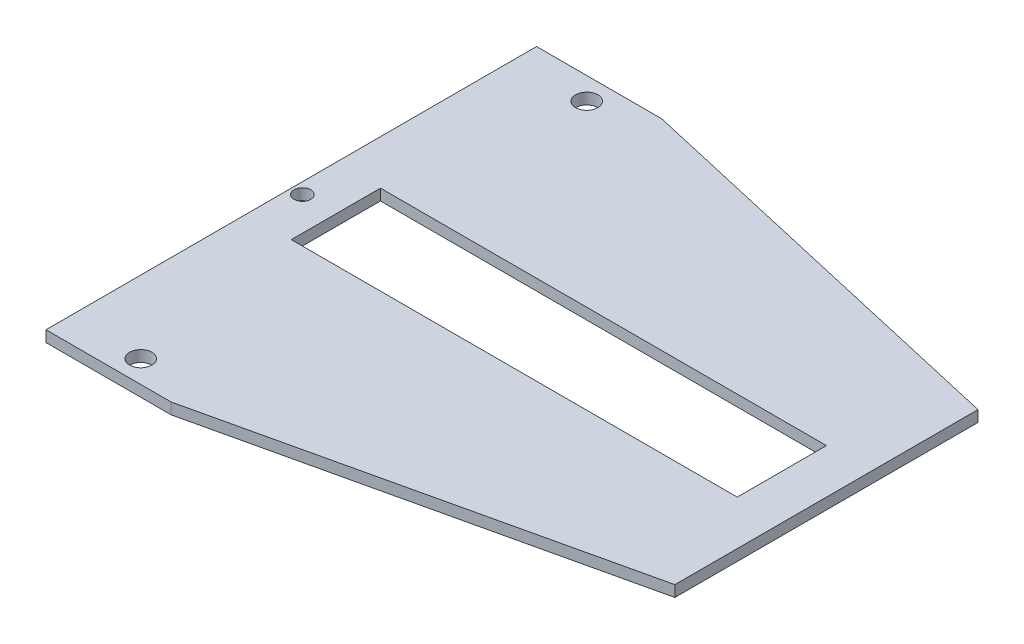
ISO-10303-21;
HEADER;
FILE_DESCRIPTION(('STEP AP214'),'2;1');
FILE_NAME('part.step','',(''),(''),'','','');
FILE_SCHEMA(('AUTOMOTIVE_DESIGN { 1 0 10303 214 1 1 1 1 }'));
ENDSEC;
DATA;
#1=APPLICATION_CONTEXT('core data for automotive mechanical design processes');
#2=APPLICATION_PROTOCOL_DEFINITION('international standard','automotive_design',2000,#1);
#3=PRODUCT_CONTEXT('',#1,'mechanical');
#4=PRODUCT('Part','Part','',(#3));
#5=PRODUCT_RELATED_PRODUCT_CATEGORY('part','',(#4));
#6=PRODUCT_DEFINITION_FORMATION('','',#4);
#7=PRODUCT_DEFINITION_CONTEXT('part definition',#1,'design');
#8=PRODUCT_DEFINITION('design','',#6,#7);
#9=PRODUCT_DEFINITION_SHAPE('','',#8);
#10=(LENGTH_UNIT() NAMED_UNIT(*) SI_UNIT(.MILLI.,.METRE.));
#11=(NAMED_UNIT(*) PLANE_ANGLE_UNIT() SI_UNIT($,.RADIAN.));
#12=(NAMED_UNIT(*) SI_UNIT($,.STERADIAN.) SOLID_ANGLE_UNIT());
#13=UNCERTAINTY_MEASURE_WITH_UNIT(LENGTH_MEASURE(1.E-05),#10,'distance_accuracy_value','');
#14=(GEOMETRIC_REPRESENTATION_CONTEXT(3) GLOBAL_UNCERTAINTY_ASSIGNED_CONTEXT((#13)) GLOBAL_UNIT_ASSIGNED_CONTEXT((#10,
#11,#12)) REPRESENTATION_CONTEXT('',''));
#15=CARTESIAN_POINT('',(0.,0.,0.));
#16=DIRECTION('',(0.,0.,1.));
#17=DIRECTION('',(1.,0.,0.));
#18=AXIS2_PLACEMENT_3D('',#15,#16,#17);
#19=CARTESIAN_POINT('',(0.,6.35,0.));
#20=DIRECTION('',(0.,-1.,0.));
#21=DIRECTION('',(0.,0.,-1.));
#22=AXIS2_PLACEMENT_3D('',#19,#20,#21);
#23=PLANE('',#22);
#24=CARTESIAN_POINT('',(41.27321438,6.35,127.));
#25=DIRECTION('',(0.,1.,0.));
#26=DIRECTION('',(0.,0.,1.));
#27=AXIS2_PLACEMENT_3D('',#24,#25,#26);
#28=CIRCLE('',#27,6.35);
#29=CARTESIAN_POINT('',(41.27321438,6.35,133.35));
#30=VERTEX_POINT('',#29);
#31=EDGE_CURVE('E151',#30,#30,#28,.T.);
#32=ORIENTED_EDGE('',*,*,#31,.F.);
#33=EDGE_LOOP('',(#32));
#34=FACE_BOUND('',#33,.T.);
#35=DIRECTION('',(0.974858506578448,0.,-0.222824801473349));
#36=VECTOR('',#35,1.);
#37=CARTESIAN_POINT('',(71.282950652,6.35,139.7));
#38=LINE('',#37,#36);
#39=CARTESIAN_POINT('',(71.282950652,6.35,139.7));
#40=VERTEX_POINT('',#39);
#41=CARTESIAN_POINT('',(304.8,6.35,86.324674442));
#42=VERTEX_POINT('',#41);
#43=EDGE_CURVE('E157',#40,#42,#38,.T.);
#44=ORIENTED_EDGE('',*,*,#43,.T.);
#45=DIRECTION('',(0.,0.,-1.));
#46=VECTOR('',#45,1.);
#47=CARTESIAN_POINT('',(304.8,6.35,-86.324674442));
#48=LINE('',#47,#46);
#49=CARTESIAN_POINT('',(304.8,6.35,-86.324674442));
#50=VERTEX_POINT('',#49);
#51=EDGE_CURVE('E160',#42,#50,#48,.T.);
#52=ORIENTED_EDGE('',*,*,#51,.T.);
#53=DIRECTION('',(-0.974858506578448,0.,-0.222824801473349));
#54=VECTOR('',#53,1.);
#55=CARTESIAN_POINT('',(71.2829506519999,6.35,-139.7));
#56=LINE('',#55,#54);
#57=CARTESIAN_POINT('',(71.2829506519999,6.35,-139.7));
#58=VERTEX_POINT('',#57);
#59=EDGE_CURVE('E163',#50,#58,#56,.T.);
#60=ORIENTED_EDGE('',*,*,#59,.T.);
#61=DIRECTION('',(-1.,0.,0.));
#62=VECTOR('',#61,1.);
#63=CARTESIAN_POINT('',(0.,6.35,-139.7));
#64=LINE('',#63,#62);
#65=CARTESIAN_POINT('',(0.,6.35,-139.7));
#66=VERTEX_POINT('',#65);
#67=EDGE_CURVE('E165',#58,#66,#64,.T.);
#68=ORIENTED_EDGE('',*,*,#67,.T.);
#69=DIRECTION('',(0.,0.,1.));
#70=VECTOR('',#69,1.);
#71=CARTESIAN_POINT('',(0.,6.35,-86.324674442));
#72=LINE('',#71,#70);
#73=CARTESIAN_POINT('',(0.,6.35,139.7));
#74=VERTEX_POINT('',#73);
#75=EDGE_CURVE('E167',#66,#74,#72,.T.);
#76=ORIENTED_EDGE('',*,*,#75,.T.);
#77=DIRECTION('',(1.,0.,0.));
#78=VECTOR('',#77,1.);
#79=CARTESIAN_POINT('',(0.,6.35,139.7));
#80=LINE('',#79,#78);
#81=EDGE_CURVE('E169',#74,#40,#80,.T.);
#82=ORIENTED_EDGE('',*,*,#81,.T.);
#83=EDGE_LOOP('',(#44,#52,#60,#68,#76,#82));
#84=FACE_BOUND('',#83,.T.);
#85=DIRECTION('',(0.,0.,1.));
#86=VECTOR('',#85,1.);
#87=CARTESIAN_POINT('',(25.4,6.35,-6.35));
#88=LINE('',#87,#86);
#89=CARTESIAN_POINT('',(25.4,6.35,-25.400000000001));
#90=VERTEX_POINT('',#89);
#91=CARTESIAN_POINT('',(25.4,6.35,25.400000000001));
#92=VERTEX_POINT('',#91);
#93=EDGE_CURVE('E110',#90,#92,#88,.T.);
#94=ORIENTED_EDGE('',*,*,#93,.F.);
#95=DIRECTION('',(-1.,0.,0.));
#96=VECTOR('',#95,1.);
#97=CARTESIAN_POINT('',(279.4,6.35,-25.4));
#98=LINE('',#97,#96);
#99=CARTESIAN_POINT('',(279.4,6.35,-25.4));
#100=VERTEX_POINT('',#99);
#101=EDGE_CURVE('E134',#100,#90,#98,.T.);
#102=ORIENTED_EDGE('',*,*,#101,.F.);
#103=DIRECTION('',(0.,0.,-1.));
#104=VECTOR('',#103,1.);
#105=CARTESIAN_POINT('',(279.4,6.35,-25.4));
#106=LINE('',#105,#104);
#107=CARTESIAN_POINT('',(279.4,6.35,25.4));
#108=VERTEX_POINT('',#107);
#109=EDGE_CURVE('E132',#108,#100,#106,.T.);
#110=ORIENTED_EDGE('',*,*,#109,.F.);
#111=DIRECTION('',(1.,0.,0.));
#112=VECTOR('',#111,1.);
#113=CARTESIAN_POINT('',(279.4,6.35,25.4));
#114=LINE('',#113,#112);
#115=EDGE_CURVE('E118',#92,#108,#114,.T.);
#116=ORIENTED_EDGE('',*,*,#115,.F.);
#117=EDGE_LOOP('',(#94,#102,#110,#116));
#118=FACE_BOUND('',#117,.T.);
#119=CARTESIAN_POINT('',(41.27321438,6.35,-127.));
#120=DIRECTION('',(0.,1.,0.));
#121=DIRECTION('',(0.,0.,-1.));
#122=AXIS2_PLACEMENT_3D('',#119,#120,#121);
#123=CIRCLE('',#122,6.35);
#124=CARTESIAN_POINT('',(41.27321438,6.35,-133.35));
#125=VERTEX_POINT('',#124);
#126=EDGE_CURVE('E141',#125,#125,#123,.T.);
#127=ORIENTED_EDGE('',*,*,#126,.F.);
#128=EDGE_LOOP('',(#127));
#129=FACE_BOUND('',#128,.T.);
#130=CARTESIAN_POINT('',(6.34821437999999,6.35,0.));
#131=DIRECTION('',(0.,1.,0.));
#132=DIRECTION('',(0.,0.,1.));
#133=AXIS2_PLACEMENT_3D('',#130,#131,#132);
#134=CIRCLE('',#133,4.7625);
#135=CARTESIAN_POINT('',(6.34821437999999,6.35,4.7625));
#136=VERTEX_POINT('',#135);
#137=EDGE_CURVE('E268',#136,#136,#134,.T.);
#138=ORIENTED_EDGE('',*,*,#137,.F.);
#139=EDGE_LOOP('',(#138));
#140=FACE_BOUND('',#139,.T.);
#141=ADVANCED_FACE('F35',(#34,#84,#118,#129,#140),#23,.F.);
#142=CARTESIAN_POINT('',(0.,0.,0.));
#143=DIRECTION('',(0.,-1.,0.));
#144=DIRECTION('',(0.,0.,-1.));
#145=AXIS2_PLACEMENT_3D('',#142,#143,#144);
#146=PLANE('',#145);
#147=CARTESIAN_POINT('',(41.27321438,0.,-127.));
#148=DIRECTION('',(0.,1.,0.));
#149=DIRECTION('',(0.,0.,-1.));
#150=AXIS2_PLACEMENT_3D('',#147,#148,#149);
#151=CIRCLE('',#150,6.35);
#152=CARTESIAN_POINT('',(41.27321438,0.,-133.35));
#153=VERTEX_POINT('',#152);
#154=EDGE_CURVE('E274',#153,#153,#151,.T.);
#155=ORIENTED_EDGE('',*,*,#154,.T.);
#156=EDGE_LOOP('',(#155));
#157=FACE_BOUND('',#156,.T.);
#158=DIRECTION('',(0.974858506578448,0.,-0.222824801473349));
#159=VECTOR('',#158,1.);
#160=CARTESIAN_POINT('',(71.282950652,0.,139.7));
#161=LINE('',#160,#159);
#162=CARTESIAN_POINT('',(71.282950652,0.,139.7));
#163=VERTEX_POINT('',#162);
#164=CARTESIAN_POINT('',(304.8,0.,86.324674442));
#165=VERTEX_POINT('',#164);
#166=EDGE_CURVE('E154',#163,#165,#161,.T.);
#167=ORIENTED_EDGE('',*,*,#166,.F.);
#168=DIRECTION('',(1.,0.,0.));
#169=VECTOR('',#168,1.);
#170=CARTESIAN_POINT('',(0.,0.,139.7));
#171=LINE('',#170,#169);
#172=CARTESIAN_POINT('',(0.,0.,139.7));
#173=VERTEX_POINT('',#172);
#174=EDGE_CURVE('E161',#173,#163,#171,.T.);
#175=ORIENTED_EDGE('',*,*,#174,.F.);
#176=DIRECTION('',(0.,0.,1.));
#177=VECTOR('',#176,1.);
#178=CARTESIAN_POINT('',(0.,0.,86.324674442));
#179=LINE('',#178,#177);
#180=CARTESIAN_POINT('',(0.,0.,-139.7));
#181=VERTEX_POINT('',#180);
#182=EDGE_CURVE('E181',#181,#173,#179,.T.);
#183=ORIENTED_EDGE('',*,*,#182,.F.);
#184=DIRECTION('',(-1.,0.,0.));
#185=VECTOR('',#184,1.);
#186=CARTESIAN_POINT('',(0.,0.,-139.7));
#187=LINE('',#186,#185);
#188=CARTESIAN_POINT('',(71.2829506519999,0.,-139.7));
#189=VERTEX_POINT('',#188);
#190=EDGE_CURVE('E178',#189,#181,#187,.T.);
#191=ORIENTED_EDGE('',*,*,#190,.F.);
#192=DIRECTION('',(-0.974858506578448,0.,-0.222824801473349));
#193=VECTOR('',#192,1.);
#194=CARTESIAN_POINT('',(71.2829506519999,0.,-139.7));
#195=LINE('',#194,#193);
#196=CARTESIAN_POINT('',(304.8,0.,-86.324674442));
#197=VERTEX_POINT('',#196);
#198=EDGE_CURVE('E176',#197,#189,#195,.T.);
#199=ORIENTED_EDGE('',*,*,#198,.F.);
#200=DIRECTION('',(0.,0.,-1.));
#201=VECTOR('',#200,1.);
#202=CARTESIAN_POINT('',(304.8,0.,-86.324674442));
#203=LINE('',#202,#201);
#204=EDGE_CURVE('E174',#165,#197,#203,.T.);
#205=ORIENTED_EDGE('',*,*,#204,.F.);
#206=EDGE_LOOP('',(#167,#175,#183,#191,#199,#205));
#207=FACE_BOUND('',#206,.T.);
#208=CARTESIAN_POINT('',(41.27321438,0.,127.));
#209=DIRECTION('',(0.,1.,0.));
#210=DIRECTION('',(0.,0.,1.));
#211=AXIS2_PLACEMENT_3D('',#208,#209,#210);
#212=CIRCLE('',#211,6.35);
#213=CARTESIAN_POINT('',(41.27321438,0.,133.35));
#214=VERTEX_POINT('',#213);
#215=EDGE_CURVE('E127',#214,#214,#212,.T.);
#216=ORIENTED_EDGE('',*,*,#215,.T.);
#217=EDGE_LOOP('',(#216));
#218=FACE_BOUND('',#217,.T.);
#219=DIRECTION('',(-1.,0.,0.));
#220=VECTOR('',#219,1.);
#221=CARTESIAN_POINT('',(279.4,0.,-25.4));
#222=LINE('',#221,#220);
#223=CARTESIAN_POINT('',(279.4,0.,-25.4));
#224=VERTEX_POINT('',#223);
#225=CARTESIAN_POINT('',(25.4,0.,-25.400000000001));
#226=VERTEX_POINT('',#225);
#227=EDGE_CURVE('E119',#224,#226,#222,.T.);
#228=ORIENTED_EDGE('',*,*,#227,.T.);
#229=DIRECTION('',(0.,0.,1.));
#230=VECTOR('',#229,1.);
#231=CARTESIAN_POINT('',(25.4,0.,25.400000000001));
#232=LINE('',#231,#230);
#233=CARTESIAN_POINT('',(25.4,0.,25.400000000001));
#234=VERTEX_POINT('',#233);
#235=EDGE_CURVE('E139',#226,#234,#232,.T.);
#236=ORIENTED_EDGE('',*,*,#235,.T.);
#237=DIRECTION('',(1.,0.,0.));
#238=VECTOR('',#237,1.);
#239=CARTESIAN_POINT('',(279.4,0.,25.4));
#240=LINE('',#239,#238);
#241=CARTESIAN_POINT('',(279.4,0.,25.4));
#242=VERTEX_POINT('',#241);
#243=EDGE_CURVE('E125',#234,#242,#240,.T.);
#244=ORIENTED_EDGE('',*,*,#243,.T.);
#245=DIRECTION('',(0.,0.,-1.));
#246=VECTOR('',#245,1.);
#247=CARTESIAN_POINT('',(279.4,0.,-25.4));
#248=LINE('',#247,#246);
#249=EDGE_CURVE('E143',#242,#224,#248,.T.);
#250=ORIENTED_EDGE('',*,*,#249,.T.);
#251=EDGE_LOOP('',(#228,#236,#244,#250));
#252=FACE_BOUND('',#251,.T.);
#253=CARTESIAN_POINT('',(6.34821437999999,0.,0.));
#254=DIRECTION('',(0.,1.,0.));
#255=DIRECTION('',(0.,0.,1.));
#256=AXIS2_PLACEMENT_3D('',#253,#254,#255);
#257=CIRCLE('',#256,4.7625);
#258=CARTESIAN_POINT('',(6.34821437999999,0.,4.7625));
#259=VERTEX_POINT('',#258);
#260=EDGE_CURVE('E271',#259,#259,#257,.T.);
#261=ORIENTED_EDGE('',*,*,#260,.T.);
#262=EDGE_LOOP('',(#261));
#263=FACE_BOUND('',#262,.T.);
#264=ADVANCED_FACE('F205',(#157,#207,#218,#252,#263),#146,.T.);
#265=CARTESIAN_POINT('',(71.282950652,6.35,139.7));
#266=DIRECTION('',(-0.222824801473349,0.,-0.974858506578448));
#267=DIRECTION('',(-0.974858506578448,0.,0.222824801473349));
#268=AXIS2_PLACEMENT_3D('',#265,#266,#267);
#269=PLANE('',#268);
#270=ORIENTED_EDGE('',*,*,#166,.T.);
#271=DIRECTION('',(0.,-1.,0.));
#272=VECTOR('',#271,1.);
#273=CARTESIAN_POINT('',(304.8,6.35,86.324674442));
#274=LINE('',#273,#272);
#275=EDGE_CURVE('E11',#42,#165,#274,.T.);
#276=ORIENTED_EDGE('',*,*,#275,.F.);
#277=ORIENTED_EDGE('',*,*,#43,.F.);
#278=DIRECTION('',(0.,-1.,0.));
#279=VECTOR('',#278,1.);
#280=CARTESIAN_POINT('',(71.282950652,6.35,139.7));
#281=LINE('',#280,#279);
#282=EDGE_CURVE('E171',#40,#163,#281,.T.);
#283=ORIENTED_EDGE('',*,*,#282,.T.);
#284=EDGE_LOOP('',(#270,#276,#277,#283));
#285=FACE_BOUND('',#284,.T.);
#286=ADVANCED_FACE('F37',(#285),#269,.F.);
#287=CARTESIAN_POINT('',(304.8,6.35,-86.324674442));
#288=DIRECTION('',(-1.,0.,0.));
#289=DIRECTION('',(0.,0.,1.));
#290=AXIS2_PLACEMENT_3D('',#287,#288,#289);
#291=PLANE('',#290);
#292=ORIENTED_EDGE('',*,*,#204,.T.);
#293=DIRECTION('',(0.,-1.,0.));
#294=VECTOR('',#293,1.);
#295=CARTESIAN_POINT('',(304.8,6.35,-86.324674442));
#296=LINE('',#295,#294);
#297=EDGE_CURVE('E43',#50,#197,#296,.T.);
#298=ORIENTED_EDGE('',*,*,#297,.F.);
#299=ORIENTED_EDGE('',*,*,#51,.F.);
#300=ORIENTED_EDGE('',*,*,#275,.T.);
#301=EDGE_LOOP('',(#292,#298,#299,#300));
#302=FACE_BOUND('',#301,.T.);
#303=ADVANCED_FACE('F221',(#302),#291,.F.);
#304=CARTESIAN_POINT('',(71.2829506519999,6.35,-139.7));
#305=DIRECTION('',(-0.222824801473349,0.,0.974858506578448));
#306=DIRECTION('',(0.974858506578448,0.,0.222824801473349));
#307=AXIS2_PLACEMENT_3D('',#304,#305,#306);
#308=PLANE('',#307);
#309=ORIENTED_EDGE('',*,*,#198,.T.);
#310=DIRECTION('',(0.,-1.,0.));
#311=VECTOR('',#310,1.);
#312=CARTESIAN_POINT('',(71.2829506519999,6.35,-139.7));
#313=LINE('',#312,#311);
#314=EDGE_CURVE('E192',#58,#189,#313,.T.);
#315=ORIENTED_EDGE('',*,*,#314,.F.);
#316=ORIENTED_EDGE('',*,*,#59,.F.);
#317=ORIENTED_EDGE('',*,*,#297,.T.);
#318=EDGE_LOOP('',(#309,#315,#316,#317));
#319=FACE_BOUND('',#318,.T.);
#320=ADVANCED_FACE('F199',(#319),#308,.F.);
#321=CARTESIAN_POINT('',(0.,6.35,-139.7));
#322=DIRECTION('',(0.,0.,1.));
#323=DIRECTION('',(1.,0.,0.));
#324=AXIS2_PLACEMENT_3D('',#321,#322,#323);
#325=PLANE('',#324);
#326=ORIENTED_EDGE('',*,*,#190,.T.);
#327=DIRECTION('',(0.,-1.,0.));
#328=VECTOR('',#327,1.);
#329=CARTESIAN_POINT('',(0.,6.35,-139.7));
#330=LINE('',#329,#328);
#331=EDGE_CURVE('E189',#66,#181,#330,.T.);
#332=ORIENTED_EDGE('',*,*,#331,.F.);
#333=ORIENTED_EDGE('',*,*,#67,.F.);
#334=ORIENTED_EDGE('',*,*,#314,.T.);
#335=EDGE_LOOP('',(#326,#332,#333,#334));
#336=FACE_BOUND('',#335,.T.);
#337=ADVANCED_FACE('F210',(#336),#325,.F.);
#338=CARTESIAN_POINT('',(0.,6.35,86.324674442));
#339=DIRECTION('',(1.,0.,0.));
#340=DIRECTION('',(0.,0.,-1.));
#341=AXIS2_PLACEMENT_3D('',#338,#339,#340);
#342=PLANE('',#341);
#343=ORIENTED_EDGE('',*,*,#182,.T.);
#344=DIRECTION('',(0.,-1.,0.));
#345=VECTOR('',#344,1.);
#346=CARTESIAN_POINT('',(0.,6.35,139.7));
#347=LINE('',#346,#345);
#348=EDGE_CURVE('E186',#74,#173,#347,.T.);
#349=ORIENTED_EDGE('',*,*,#348,.F.);
#350=ORIENTED_EDGE('',*,*,#75,.F.);
#351=ORIENTED_EDGE('',*,*,#331,.T.);
#352=EDGE_LOOP('',(#343,#349,#350,#351));
#353=FACE_BOUND('',#352,.T.);
#354=ADVANCED_FACE('F214',(#353),#342,.F.);
#355=CARTESIAN_POINT('',(0.,6.35,139.7));
#356=DIRECTION('',(0.,0.,-1.));
#357=DIRECTION('',(-1.,0.,0.));
#358=AXIS2_PLACEMENT_3D('',#355,#356,#357);
#359=PLANE('',#358);
#360=ORIENTED_EDGE('',*,*,#174,.T.);
#361=ORIENTED_EDGE('',*,*,#282,.F.);
#362=ORIENTED_EDGE('',*,*,#81,.F.);
#363=ORIENTED_EDGE('',*,*,#348,.T.);
#364=EDGE_LOOP('',(#360,#361,#362,#363));
#365=FACE_BOUND('',#364,.T.);
#366=ADVANCED_FACE('F224',(#365),#359,.F.);
#367=CARTESIAN_POINT('',(41.27321438,6.35,127.));
#368=DIRECTION('',(0.,-1.,0.));
#369=DIRECTION('',(0.,0.,-1.));
#370=AXIS2_PLACEMENT_3D('',#367,#368,#369);
#371=CYLINDRICAL_SURFACE('',#370,6.35);
#372=ORIENTED_EDGE('',*,*,#31,.T.);
#373=EDGE_LOOP('',(#372));
#374=FACE_BOUND('',#373,.T.);
#375=ORIENTED_EDGE('',*,*,#215,.F.);
#376=EDGE_LOOP('',(#375));
#377=FACE_BOUND('',#376,.T.);
#378=ADVANCED_FACE('F226',(#374,#377),#371,.F.);
#379=CARTESIAN_POINT('',(25.4,6.35,25.400000000001));
#380=DIRECTION('',(1.,0.,0.));
#381=DIRECTION('',(0.,0.,-1.));
#382=AXIS2_PLACEMENT_3D('',#379,#380,#381);
#383=PLANE('',#382);
#384=ORIENTED_EDGE('',*,*,#235,.F.);
#385=DIRECTION('',(0.,-1.,0.));
#386=VECTOR('',#385,1.);
#387=CARTESIAN_POINT('',(25.4,6.35,-25.400000000001));
#388=LINE('',#387,#386);
#389=EDGE_CURVE('E55',#90,#226,#388,.T.);
#390=ORIENTED_EDGE('',*,*,#389,.F.);
#391=ORIENTED_EDGE('',*,*,#93,.T.);
#392=DIRECTION('',(0.,-1.,0.));
#393=VECTOR('',#392,1.);
#394=CARTESIAN_POINT('',(25.4,6.35,25.400000000001));
#395=LINE('',#394,#393);
#396=EDGE_CURVE('E113',#92,#234,#395,.T.);
#397=ORIENTED_EDGE('',*,*,#396,.T.);
#398=EDGE_LOOP('',(#384,#390,#391,#397));
#399=FACE_BOUND('',#398,.T.);
#400=ADVANCED_FACE('F112',(#399),#383,.T.);
#401=CARTESIAN_POINT('',(279.4,6.35,25.4));
#402=DIRECTION('',(0.,0.,-1.));
#403=DIRECTION('',(-1.,0.,0.));
#404=AXIS2_PLACEMENT_3D('',#401,#402,#403);
#405=PLANE('',#404);
#406=ORIENTED_EDGE('',*,*,#243,.F.);
#407=ORIENTED_EDGE('',*,*,#396,.F.);
#408=ORIENTED_EDGE('',*,*,#115,.T.);
#409=DIRECTION('',(0.,-1.,0.));
#410=VECTOR('',#409,1.);
#411=CARTESIAN_POINT('',(279.4,6.35,25.4));
#412=LINE('',#411,#410);
#413=EDGE_CURVE('E128',#108,#242,#412,.T.);
#414=ORIENTED_EDGE('',*,*,#413,.T.);
#415=EDGE_LOOP('',(#406,#407,#408,#414));
#416=FACE_BOUND('',#415,.T.);
#417=ADVANCED_FACE('F122',(#416),#405,.T.);
#418=CARTESIAN_POINT('',(279.4,6.35,-25.4));
#419=DIRECTION('',(-1.,0.,0.));
#420=DIRECTION('',(0.,0.,1.));
#421=AXIS2_PLACEMENT_3D('',#418,#419,#420);
#422=PLANE('',#421);
#423=ORIENTED_EDGE('',*,*,#249,.F.);
#424=ORIENTED_EDGE('',*,*,#413,.F.);
#425=ORIENTED_EDGE('',*,*,#109,.T.);
#426=DIRECTION('',(0.,-1.,0.));
#427=VECTOR('',#426,1.);
#428=CARTESIAN_POINT('',(279.4,6.35,-25.4));
#429=LINE('',#428,#427);
#430=EDGE_CURVE('E50',#100,#224,#429,.T.);
#431=ORIENTED_EDGE('',*,*,#430,.T.);
#432=EDGE_LOOP('',(#423,#424,#425,#431));
#433=FACE_BOUND('',#432,.T.);
#434=ADVANCED_FACE('F249',(#433),#422,.T.);
#435=CARTESIAN_POINT('',(279.4,6.35,-25.4));
#436=DIRECTION('',(0.,0.,1.));
#437=DIRECTION('',(1.,0.,0.));
#438=AXIS2_PLACEMENT_3D('',#435,#436,#437);
#439=PLANE('',#438);
#440=ORIENTED_EDGE('',*,*,#227,.F.);
#441=ORIENTED_EDGE('',*,*,#430,.F.);
#442=ORIENTED_EDGE('',*,*,#101,.T.);
#443=ORIENTED_EDGE('',*,*,#389,.T.);
#444=EDGE_LOOP('',(#440,#441,#442,#443));
#445=FACE_BOUND('',#444,.T.);
#446=ADVANCED_FACE('F252',(#445),#439,.T.);
#447=CARTESIAN_POINT('',(41.27321438,6.35,-127.));
#448=DIRECTION('',(0.,-1.,0.));
#449=DIRECTION('',(0.,0.,-1.));
#450=AXIS2_PLACEMENT_3D('',#447,#448,#449);
#451=CYLINDRICAL_SURFACE('',#450,6.35);
#452=ORIENTED_EDGE('',*,*,#126,.T.);
#453=EDGE_LOOP('',(#452));
#454=FACE_BOUND('',#453,.T.);
#455=ORIENTED_EDGE('',*,*,#154,.F.);
#456=EDGE_LOOP('',(#455));
#457=FACE_BOUND('',#456,.T.);
#458=ADVANCED_FACE('F256',(#454,#457),#451,.F.);
#459=CARTESIAN_POINT('',(6.34821437999999,6.35,0.));
#460=DIRECTION('',(0.,-1.,0.));
#461=DIRECTION('',(0.,0.,-1.));
#462=AXIS2_PLACEMENT_3D('',#459,#460,#461);
#463=CYLINDRICAL_SURFACE('',#462,4.7625);
#464=ORIENTED_EDGE('',*,*,#137,.T.);
#465=EDGE_LOOP('',(#464));
#466=FACE_BOUND('',#465,.T.);
#467=ORIENTED_EDGE('',*,*,#260,.F.);
#468=EDGE_LOOP('',(#467));
#469=FACE_BOUND('',#468,.T.);
#470=ADVANCED_FACE('F259',(#466,#469),#463,.F.);
#471=CLOSED_SHELL('',(#141,#264,#286,#303,#320,#337,#354,#366,#378,#400,#417,#434,#446,#458,#470));
#472=MANIFOLD_SOLID_BREP('B2',#471);
#473=ADVANCED_BREP_SHAPE_REPRESENTATION('',(#18,#472),#14);
#474=SHAPE_DEFINITION_REPRESENTATION(#9,#473);
ENDSEC;
END-ISO-10303-21;
